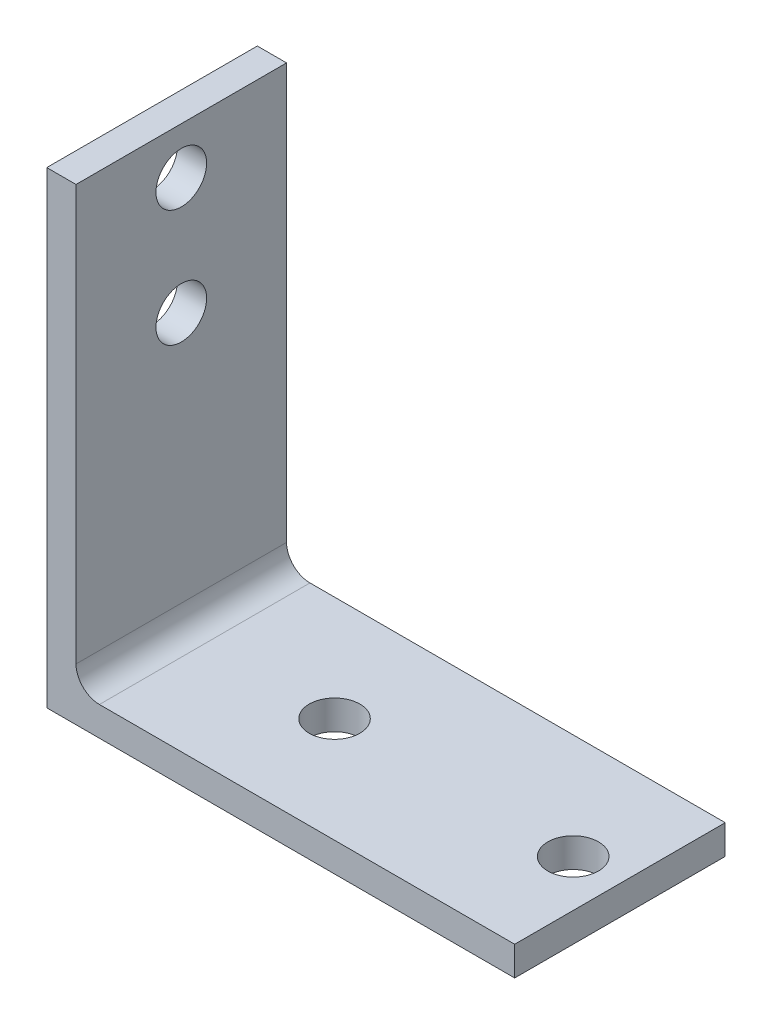
ISO-10303-21;
HEADER;
FILE_DESCRIPTION(('STEP AP214'),'2;1');
FILE_NAME('part.step','',(''),(''),'','','');
FILE_SCHEMA(('AUTOMOTIVE_DESIGN { 1 0 10303 214 1 1 1 1 }'));
ENDSEC;
DATA;
#1=APPLICATION_CONTEXT('core data for automotive mechanical design processes');
#2=APPLICATION_PROTOCOL_DEFINITION('international standard','automotive_design',2000,#1);
#3=PRODUCT_CONTEXT('',#1,'mechanical');
#4=PRODUCT('Part','Part','',(#3));
#5=PRODUCT_RELATED_PRODUCT_CATEGORY('part','',(#4));
#6=PRODUCT_DEFINITION_FORMATION('','',#4);
#7=PRODUCT_DEFINITION_CONTEXT('part definition',#1,'design');
#8=PRODUCT_DEFINITION('design','',#6,#7);
#9=PRODUCT_DEFINITION_SHAPE('','',#8);
#10=(LENGTH_UNIT() NAMED_UNIT(*) SI_UNIT(.MILLI.,.METRE.));
#11=(NAMED_UNIT(*) PLANE_ANGLE_UNIT() SI_UNIT($,.RADIAN.));
#12=(NAMED_UNIT(*) SI_UNIT($,.STERADIAN.) SOLID_ANGLE_UNIT());
#13=UNCERTAINTY_MEASURE_WITH_UNIT(LENGTH_MEASURE(1.E-05),#10,'distance_accuracy_value','');
#14=(GEOMETRIC_REPRESENTATION_CONTEXT(3) GLOBAL_UNCERTAINTY_ASSIGNED_CONTEXT((#13)) GLOBAL_UNIT_ASSIGNED_CONTEXT((#10,
#11,#12)) REPRESENTATION_CONTEXT('',''));
#15=CARTESIAN_POINT('',(0.,0.,0.));
#16=DIRECTION('',(0.,0.,1.));
#17=DIRECTION('',(1.,0.,0.));
#18=AXIS2_PLACEMENT_3D('',#15,#16,#17);
#19=CARTESIAN_POINT('',(3.175,0.,-11.43));
#20=DIRECTION('',(0.,1.,0.));
#21=DIRECTION('',(-1.,0.,0.));
#22=AXIS2_PLACEMENT_3D('',#19,#20,#21);
#23=PLANE('',#22);
#24=DIRECTION('',(-1.,0.,0.));
#25=VECTOR('',#24,1.);
#26=CARTESIAN_POINT('',(3.175,0.,11.43));
#27=LINE('',#26,#25);
#28=CARTESIAN_POINT('',(3.175,0.,11.43));
#29=VERTEX_POINT('',#28);
#30=CARTESIAN_POINT('',(0.,0.,11.43));
#31=VERTEX_POINT('',#30);
#32=EDGE_CURVE('E132',#29,#31,#27,.T.);
#33=ORIENTED_EDGE('',*,*,#32,.F.);
#34=DIRECTION('',(0.,0.,1.));
#35=VECTOR('',#34,1.);
#36=CARTESIAN_POINT('',(3.175,0.,-11.43));
#37=LINE('',#36,#35);
#38=CARTESIAN_POINT('',(3.175,0.,-11.43));
#39=VERTEX_POINT('',#38);
#40=EDGE_CURVE('E11',#39,#29,#37,.T.);
#41=ORIENTED_EDGE('',*,*,#40,.F.);
#42=DIRECTION('',(-1.,0.,0.));
#43=VECTOR('',#42,1.);
#44=CARTESIAN_POINT('',(3.175,0.,-11.43));
#45=LINE('',#44,#43);
#46=CARTESIAN_POINT('',(0.,0.,-11.43));
#47=VERTEX_POINT('',#46);
#48=EDGE_CURVE('E150',#39,#47,#45,.T.);
#49=ORIENTED_EDGE('',*,*,#48,.T.);
#50=DIRECTION('',(0.,0.,1.));
#51=VECTOR('',#50,1.);
#52=CARTESIAN_POINT('',(0.,0.,-11.43));
#53=LINE('',#52,#51);
#54=EDGE_CURVE('E44',#47,#31,#53,.T.);
#55=ORIENTED_EDGE('',*,*,#54,.T.);
#56=EDGE_LOOP('',(#33,#41,#49,#55));
#57=FACE_BOUND('',#56,.T.);
#58=ADVANCED_FACE('F41',(#57),#23,.T.);
#59=CARTESIAN_POINT('',(3.175,-45.085,-11.43));
#60=DIRECTION('',(1.,0.,0.));
#61=DIRECTION('',(0.,1.,0.));
#62=AXIS2_PLACEMENT_3D('',#59,#60,#61);
#63=PLANE('',#62);
#64=CARTESIAN_POINT('',(3.175,-5.08,0.));
#65=DIRECTION('',(1.,0.,0.));
#66=DIRECTION('',(0.,1.,0.));
#67=AXIS2_PLACEMENT_3D('',#64,#65,#66);
#68=CIRCLE('',#67,2.75);
#69=CARTESIAN_POINT('',(3.175,-2.33,0.));
#70=VERTEX_POINT('',#69);
#71=EDGE_CURVE('E202',#70,#70,#68,.T.);
#72=ORIENTED_EDGE('',*,*,#71,.F.);
#73=EDGE_LOOP('',(#72));
#74=FACE_BOUND('',#73,.T.);
#75=CARTESIAN_POINT('',(3.175,-17.78,0.));
#76=DIRECTION('',(1.,0.,0.));
#77=DIRECTION('',(0.,1.,0.));
#78=AXIS2_PLACEMENT_3D('',#75,#76,#77);
#79=CIRCLE('',#78,2.75);
#80=CARTESIAN_POINT('',(3.175,-15.03,0.));
#81=VERTEX_POINT('',#80);
#82=EDGE_CURVE('E198',#81,#81,#79,.T.);
#83=ORIENTED_EDGE('',*,*,#82,.F.);
#84=EDGE_LOOP('',(#83));
#85=FACE_BOUND('',#84,.T.);
#86=DIRECTION('',(0.,1.,0.));
#87=VECTOR('',#86,1.);
#88=CARTESIAN_POINT('',(3.175,-45.085,11.43));
#89=LINE('',#88,#87);
#90=CARTESIAN_POINT('',(3.175,-45.085,11.43));
#91=VERTEX_POINT('',#90);
#92=EDGE_CURVE('E148',#91,#29,#89,.T.);
#93=ORIENTED_EDGE('',*,*,#92,.F.);
#94=DIRECTION('',(0.,0.,1.));
#95=VECTOR('',#94,1.);
#96=CARTESIAN_POINT('',(3.175,-45.085,-11.43));
#97=LINE('',#96,#95);
#98=CARTESIAN_POINT('',(3.175,-45.085,-11.43));
#99=VERTEX_POINT('',#98);
#100=EDGE_CURVE('E50',#99,#91,#97,.T.);
#101=ORIENTED_EDGE('',*,*,#100,.F.);
#102=DIRECTION('',(0.,1.,0.));
#103=VECTOR('',#102,1.);
#104=CARTESIAN_POINT('',(3.175,-45.085,-11.43));
#105=LINE('',#104,#103);
#106=EDGE_CURVE('E122',#99,#39,#105,.T.);
#107=ORIENTED_EDGE('',*,*,#106,.T.);
#108=ORIENTED_EDGE('',*,*,#40,.T.);
#109=EDGE_LOOP('',(#93,#101,#107,#108));
#110=FACE_BOUND('',#109,.T.);
#111=ADVANCED_FACE('F160',(#74,#85,#110),#63,.T.);
#112=CARTESIAN_POINT('',(5.715,-45.085,-11.43));
#113=DIRECTION('',(0.,0.,1.));
#114=DIRECTION('',(1.,0.,0.));
#115=AXIS2_PLACEMENT_3D('',#112,#113,#114);
#116=CYLINDRICAL_SURFACE('',#115,2.54);
#117=CARTESIAN_POINT('',(5.715,-45.085,11.43));
#118=DIRECTION('',(0.,0.,-1.));
#119=DIRECTION('',(-1.,0.,0.));
#120=AXIS2_PLACEMENT_3D('',#117,#118,#119);
#121=CIRCLE('',#120,2.54);
#122=CARTESIAN_POINT('',(5.715,-47.625,11.43));
#123=VERTEX_POINT('',#122);
#124=EDGE_CURVE('E109',#123,#91,#121,.T.);
#125=ORIENTED_EDGE('',*,*,#124,.F.);
#126=DIRECTION('',(0.,0.,1.));
#127=VECTOR('',#126,1.);
#128=CARTESIAN_POINT('',(5.715,-47.625,-11.43));
#129=LINE('',#128,#127);
#130=CARTESIAN_POINT('',(5.715,-47.625,-11.43));
#131=VERTEX_POINT('',#130);
#132=EDGE_CURVE('E104',#131,#123,#129,.T.);
#133=ORIENTED_EDGE('',*,*,#132,.F.);
#134=CARTESIAN_POINT('',(5.715,-45.085,-11.43));
#135=DIRECTION('',(0.,0.,-1.));
#136=DIRECTION('',(-1.,0.,0.));
#137=AXIS2_PLACEMENT_3D('',#134,#135,#136);
#138=CIRCLE('',#137,2.54);
#139=EDGE_CURVE('E107',#131,#99,#138,.T.);
#140=ORIENTED_EDGE('',*,*,#139,.T.);
#141=ORIENTED_EDGE('',*,*,#100,.T.);
#142=EDGE_LOOP('',(#125,#133,#140,#141));
#143=FACE_BOUND('',#142,.T.);
#144=ADVANCED_FACE('F106',(#143),#116,.F.);
#145=CARTESIAN_POINT('',(50.8,-47.625,-11.43));
#146=DIRECTION('',(0.,1.,0.));
#147=DIRECTION('',(0.,0.,1.));
#148=AXIS2_PLACEMENT_3D('',#145,#146,#147);
#149=PLANE('',#148);
#150=CARTESIAN_POINT('',(19.812,-47.625,0.));
#151=DIRECTION('',(0.,1.,0.));
#152=DIRECTION('',(0.,0.,1.));
#153=AXIS2_PLACEMENT_3D('',#150,#151,#152);
#154=CIRCLE('',#153,2.75);
#155=CARTESIAN_POINT('',(19.812,-47.625,2.75));
#156=VERTEX_POINT('',#155);
#157=EDGE_CURVE('E205',#156,#156,#154,.T.);
#158=ORIENTED_EDGE('',*,*,#157,.F.);
#159=EDGE_LOOP('',(#158));
#160=FACE_BOUND('',#159,.T.);
#161=CARTESIAN_POINT('',(45.72,-47.625,0.));
#162=DIRECTION('',(0.,1.,0.));
#163=DIRECTION('',(0.,0.,1.));
#164=AXIS2_PLACEMENT_3D('',#161,#162,#163);
#165=CIRCLE('',#164,2.75);
#166=CARTESIAN_POINT('',(45.72,-47.625,2.75));
#167=VERTEX_POINT('',#166);
#168=EDGE_CURVE('E221',#167,#167,#165,.T.);
#169=ORIENTED_EDGE('',*,*,#168,.F.);
#170=EDGE_LOOP('',(#169));
#171=FACE_BOUND('',#170,.T.);
#172=DIRECTION('',(-1.,0.,0.));
#173=VECTOR('',#172,1.);
#174=CARTESIAN_POINT('',(50.8,-47.625,11.43));
#175=LINE('',#174,#173);
#176=CARTESIAN_POINT('',(50.8,-47.625,11.43));
#177=VERTEX_POINT('',#176);
#178=EDGE_CURVE('E145',#177,#123,#175,.T.);
#179=ORIENTED_EDGE('',*,*,#178,.F.);
#180=DIRECTION('',(0.,0.,1.));
#181=VECTOR('',#180,1.);
#182=CARTESIAN_POINT('',(50.8,-47.625,-11.43));
#183=LINE('',#182,#181);
#184=CARTESIAN_POINT('',(50.8,-47.625,-11.43));
#185=VERTEX_POINT('',#184);
#186=EDGE_CURVE('E114',#185,#177,#183,.T.);
#187=ORIENTED_EDGE('',*,*,#186,.F.);
#188=DIRECTION('',(-1.,0.,0.));
#189=VECTOR('',#188,1.);
#190=CARTESIAN_POINT('',(50.8,-47.625,-11.43));
#191=LINE('',#190,#189);
#192=EDGE_CURVE('E120',#185,#131,#191,.T.);
#193=ORIENTED_EDGE('',*,*,#192,.T.);
#194=ORIENTED_EDGE('',*,*,#132,.T.);
#195=EDGE_LOOP('',(#179,#187,#193,#194));
#196=FACE_BOUND('',#195,.T.);
#197=ADVANCED_FACE('F124',(#160,#171,#196),#149,.T.);
#198=CARTESIAN_POINT('',(50.8,-50.8,-11.43));
#199=DIRECTION('',(1.,0.,0.));
#200=DIRECTION('',(0.,0.,-1.));
#201=AXIS2_PLACEMENT_3D('',#198,#199,#200);
#202=PLANE('',#201);
#203=DIRECTION('',(0.,1.,0.));
#204=VECTOR('',#203,1.);
#205=CARTESIAN_POINT('',(50.8,-50.8,11.43));
#206=LINE('',#205,#204);
#207=CARTESIAN_POINT('',(50.8,-50.8,11.43));
#208=VERTEX_POINT('',#207);
#209=EDGE_CURVE('E142',#208,#177,#206,.T.);
#210=ORIENTED_EDGE('',*,*,#209,.F.);
#211=DIRECTION('',(0.,0.,1.));
#212=VECTOR('',#211,1.);
#213=CARTESIAN_POINT('',(50.8,-50.8,-11.43));
#214=LINE('',#213,#212);
#215=CARTESIAN_POINT('',(50.8,-50.8,-11.43));
#216=VERTEX_POINT('',#215);
#217=EDGE_CURVE('E154',#216,#208,#214,.T.);
#218=ORIENTED_EDGE('',*,*,#217,.F.);
#219=DIRECTION('',(0.,1.,0.));
#220=VECTOR('',#219,1.);
#221=CARTESIAN_POINT('',(50.8,-50.8,-11.43));
#222=LINE('',#221,#220);
#223=EDGE_CURVE('E125',#216,#185,#222,.T.);
#224=ORIENTED_EDGE('',*,*,#223,.T.);
#225=ORIENTED_EDGE('',*,*,#186,.T.);
#226=EDGE_LOOP('',(#210,#218,#224,#225));
#227=FACE_BOUND('',#226,.T.);
#228=ADVANCED_FACE('F178',(#227),#202,.T.);
#229=CARTESIAN_POINT('',(0.,-50.8,-11.43));
#230=DIRECTION('',(0.,-1.,0.));
#231=DIRECTION('',(0.,0.,-1.));
#232=AXIS2_PLACEMENT_3D('',#229,#230,#231);
#233=PLANE('',#232);
#234=CARTESIAN_POINT('',(19.812,-50.8,0.));
#235=DIRECTION('',(0.,1.,0.));
#236=DIRECTION('',(0.,0.,1.));
#237=AXIS2_PLACEMENT_3D('',#234,#235,#236);
#238=CIRCLE('',#237,2.75);
#239=CARTESIAN_POINT('',(19.812,-50.8,2.75));
#240=VERTEX_POINT('',#239);
#241=EDGE_CURVE('E199',#240,#240,#238,.T.);
#242=ORIENTED_EDGE('',*,*,#241,.T.);
#243=EDGE_LOOP('',(#242));
#244=FACE_BOUND('',#243,.T.);
#245=CARTESIAN_POINT('',(45.72,-50.8,0.));
#246=DIRECTION('',(0.,1.,0.));
#247=DIRECTION('',(0.,0.,1.));
#248=AXIS2_PLACEMENT_3D('',#245,#246,#247);
#249=CIRCLE('',#248,2.75);
#250=CARTESIAN_POINT('',(45.72,-50.8,2.75));
#251=VERTEX_POINT('',#250);
#252=EDGE_CURVE('E218',#251,#251,#249,.T.);
#253=ORIENTED_EDGE('',*,*,#252,.T.);
#254=EDGE_LOOP('',(#253));
#255=FACE_BOUND('',#254,.T.);
#256=DIRECTION('',(1.,0.,0.));
#257=VECTOR('',#256,1.);
#258=CARTESIAN_POINT('',(0.,-50.8,11.43));
#259=LINE('',#258,#257);
#260=CARTESIAN_POINT('',(0.,-50.8,11.43));
#261=VERTEX_POINT('',#260);
#262=EDGE_CURVE('E139',#261,#208,#259,.T.);
#263=ORIENTED_EDGE('',*,*,#262,.F.);
#264=DIRECTION('',(0.,0.,1.));
#265=VECTOR('',#264,1.);
#266=CARTESIAN_POINT('',(0.,-50.8,-11.43));
#267=LINE('',#266,#265);
#268=CARTESIAN_POINT('',(0.,-50.8,-11.43));
#269=VERTEX_POINT('',#268);
#270=EDGE_CURVE('E155',#269,#261,#267,.T.);
#271=ORIENTED_EDGE('',*,*,#270,.F.);
#272=DIRECTION('',(1.,0.,0.));
#273=VECTOR('',#272,1.);
#274=CARTESIAN_POINT('',(0.,-50.8,-11.43));
#275=LINE('',#274,#273);
#276=EDGE_CURVE('E127',#269,#216,#275,.T.);
#277=ORIENTED_EDGE('',*,*,#276,.T.);
#278=ORIENTED_EDGE('',*,*,#217,.T.);
#279=EDGE_LOOP('',(#263,#271,#277,#278));
#280=FACE_BOUND('',#279,.T.);
#281=ADVANCED_FACE('F182',(#244,#255,#280),#233,.T.);
#282=CARTESIAN_POINT('',(0.,0.,-11.43));
#283=DIRECTION('',(-1.,0.,0.));
#284=DIRECTION('',(0.,0.,1.));
#285=AXIS2_PLACEMENT_3D('',#282,#283,#284);
#286=PLANE('',#285);
#287=CARTESIAN_POINT('',(0.,-5.08,0.));
#288=DIRECTION('',(1.,0.,0.));
#289=DIRECTION('',(0.,1.,0.));
#290=AXIS2_PLACEMENT_3D('',#287,#288,#289);
#291=CIRCLE('',#290,2.75);
#292=CARTESIAN_POINT('',(0.,-2.33,0.));
#293=VERTEX_POINT('',#292);
#294=EDGE_CURVE('E136',#293,#293,#291,.T.);
#295=ORIENTED_EDGE('',*,*,#294,.T.);
#296=EDGE_LOOP('',(#295));
#297=FACE_BOUND('',#296,.T.);
#298=CARTESIAN_POINT('',(0.,-17.78,0.));
#299=DIRECTION('',(1.,0.,0.));
#300=DIRECTION('',(0.,1.,0.));
#301=AXIS2_PLACEMENT_3D('',#298,#299,#300);
#302=CIRCLE('',#301,2.75);
#303=CARTESIAN_POINT('',(0.,-15.03,0.));
#304=VERTEX_POINT('',#303);
#305=EDGE_CURVE('E196',#304,#304,#302,.T.);
#306=ORIENTED_EDGE('',*,*,#305,.T.);
#307=EDGE_LOOP('',(#306));
#308=FACE_BOUND('',#307,.T.);
#309=DIRECTION('',(0.,-1.,0.));
#310=VECTOR('',#309,1.);
#311=CARTESIAN_POINT('',(0.,0.,11.43));
#312=LINE('',#311,#310);
#313=EDGE_CURVE('E135',#31,#261,#312,.T.);
#314=ORIENTED_EDGE('',*,*,#313,.F.);
#315=ORIENTED_EDGE('',*,*,#54,.F.);
#316=DIRECTION('',(0.,-1.,0.));
#317=VECTOR('',#316,1.);
#318=CARTESIAN_POINT('',(0.,0.,-11.43));
#319=LINE('',#318,#317);
#320=EDGE_CURVE('E210',#47,#269,#319,.T.);
#321=ORIENTED_EDGE('',*,*,#320,.T.);
#322=ORIENTED_EDGE('',*,*,#270,.T.);
#323=EDGE_LOOP('',(#314,#315,#321,#322));
#324=FACE_BOUND('',#323,.T.);
#325=ADVANCED_FACE('F157',(#297,#308,#324),#286,.T.);
#326=CARTESIAN_POINT('',(5.715,-45.085,-11.43));
#327=DIRECTION('',(0.,0.,-1.));
#328=DIRECTION('',(-1.,0.,0.));
#329=AXIS2_PLACEMENT_3D('',#326,#327,#328);
#330=PLANE('',#329);
#331=ORIENTED_EDGE('',*,*,#48,.F.);
#332=ORIENTED_EDGE('',*,*,#106,.F.);
#333=ORIENTED_EDGE('',*,*,#139,.F.);
#334=ORIENTED_EDGE('',*,*,#192,.F.);
#335=ORIENTED_EDGE('',*,*,#223,.F.);
#336=ORIENTED_EDGE('',*,*,#276,.F.);
#337=ORIENTED_EDGE('',*,*,#320,.F.);
#338=EDGE_LOOP('',(#331,#332,#333,#334,#335,#336,#337));
#339=FACE_BOUND('',#338,.T.);
#340=ADVANCED_FACE('F118',(#339),#330,.T.);
#341=CARTESIAN_POINT('',(5.715,-45.085,11.43));
#342=DIRECTION('',(0.,0.,-1.));
#343=DIRECTION('',(-1.,0.,0.));
#344=AXIS2_PLACEMENT_3D('',#341,#342,#343);
#345=PLANE('',#344);
#346=ORIENTED_EDGE('',*,*,#32,.T.);
#347=ORIENTED_EDGE('',*,*,#313,.T.);
#348=ORIENTED_EDGE('',*,*,#262,.T.);
#349=ORIENTED_EDGE('',*,*,#209,.T.);
#350=ORIENTED_EDGE('',*,*,#178,.T.);
#351=ORIENTED_EDGE('',*,*,#124,.T.);
#352=ORIENTED_EDGE('',*,*,#92,.T.);
#353=EDGE_LOOP('',(#346,#347,#348,#349,#350,#351,#352));
#354=FACE_BOUND('',#353,.T.);
#355=ADVANCED_FACE('F159',(#354),#345,.F.);
#356=CARTESIAN_POINT('',(0.,-17.78,0.));
#357=DIRECTION('',(1.,0.,0.));
#358=DIRECTION('',(0.,1.,0.));
#359=AXIS2_PLACEMENT_3D('',#356,#357,#358);
#360=CYLINDRICAL_SURFACE('',#359,2.75);
#361=ORIENTED_EDGE('',*,*,#305,.F.);
#362=EDGE_LOOP('',(#361));
#363=FACE_BOUND('',#362,.T.);
#364=ORIENTED_EDGE('',*,*,#82,.T.);
#365=EDGE_LOOP('',(#364));
#366=FACE_BOUND('',#365,.T.);
#367=ADVANCED_FACE('F242',(#363,#366),#360,.F.);
#368=CARTESIAN_POINT('',(0.,-5.08,0.));
#369=DIRECTION('',(1.,0.,0.));
#370=DIRECTION('',(0.,1.,0.));
#371=AXIS2_PLACEMENT_3D('',#368,#369,#370);
#372=CYLINDRICAL_SURFACE('',#371,2.75);
#373=ORIENTED_EDGE('',*,*,#294,.F.);
#374=EDGE_LOOP('',(#373));
#375=FACE_BOUND('',#374,.T.);
#376=ORIENTED_EDGE('',*,*,#71,.T.);
#377=EDGE_LOOP('',(#376));
#378=FACE_BOUND('',#377,.T.);
#379=ADVANCED_FACE('F233',(#375,#378),#372,.F.);
#380=CARTESIAN_POINT('',(45.72,-50.8,0.));
#381=DIRECTION('',(0.,1.,0.));
#382=DIRECTION('',(0.,0.,1.));
#383=AXIS2_PLACEMENT_3D('',#380,#381,#382);
#384=CYLINDRICAL_SURFACE('',#383,2.75);
#385=ORIENTED_EDGE('',*,*,#252,.F.);
#386=EDGE_LOOP('',(#385));
#387=FACE_BOUND('',#386,.T.);
#388=ORIENTED_EDGE('',*,*,#168,.T.);
#389=EDGE_LOOP('',(#388));
#390=FACE_BOUND('',#389,.T.);
#391=ADVANCED_FACE('F231',(#387,#390),#384,.F.);
#392=CARTESIAN_POINT('',(19.812,-50.8,0.));
#393=DIRECTION('',(0.,1.,0.));
#394=DIRECTION('',(0.,0.,1.));
#395=AXIS2_PLACEMENT_3D('',#392,#393,#394);
#396=CYLINDRICAL_SURFACE('',#395,2.75);
#397=ORIENTED_EDGE('',*,*,#241,.F.);
#398=EDGE_LOOP('',(#397));
#399=FACE_BOUND('',#398,.T.);
#400=ORIENTED_EDGE('',*,*,#157,.T.);
#401=EDGE_LOOP('',(#400));
#402=FACE_BOUND('',#401,.T.);
#403=ADVANCED_FACE('F227',(#399,#402),#396,.F.);
#404=CLOSED_SHELL('',(#58,#111,#144,#197,#228,#281,#325,#340,#355,#367,#379,#391,#403));
#405=MANIFOLD_SOLID_BREP('B2',#404);
#406=ADVANCED_BREP_SHAPE_REPRESENTATION('',(#18,#405),#14);
#407=SHAPE_DEFINITION_REPRESENTATION(#9,#406);
ENDSEC;
END-ISO-10303-21;
